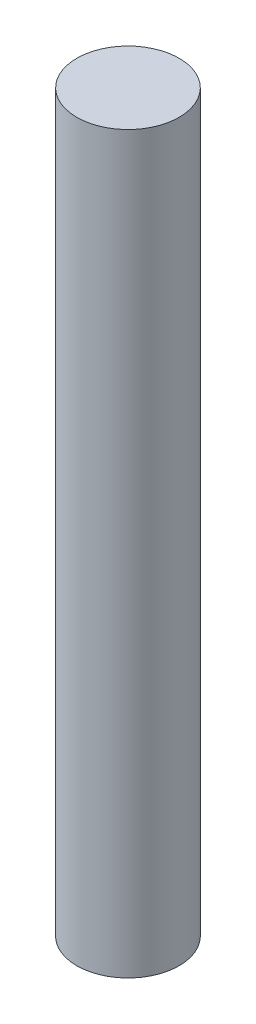
ISO-10303-21;
HEADER;
FILE_DESCRIPTION(('STEP AP214'),'2;1');
FILE_NAME('part.step','',(''),(''),'','','');
FILE_SCHEMA(('AUTOMOTIVE_DESIGN { 1 0 10303 214 1 1 1 1 }'));
ENDSEC;
DATA;
#1=APPLICATION_CONTEXT('core data for automotive mechanical design processes');
#2=APPLICATION_PROTOCOL_DEFINITION('international standard','automotive_design',2000,#1);
#3=PRODUCT_CONTEXT('',#1,'mechanical');
#4=PRODUCT('Part','Part','',(#3));
#5=PRODUCT_RELATED_PRODUCT_CATEGORY('part','',(#4));
#6=PRODUCT_DEFINITION_FORMATION('','',#4);
#7=PRODUCT_DEFINITION_CONTEXT('part definition',#1,'design');
#8=PRODUCT_DEFINITION('design','',#6,#7);
#9=PRODUCT_DEFINITION_SHAPE('','',#8);
#10=(LENGTH_UNIT() NAMED_UNIT(*) SI_UNIT(.MILLI.,.METRE.));
#11=(NAMED_UNIT(*) PLANE_ANGLE_UNIT() SI_UNIT($,.RADIAN.));
#12=(NAMED_UNIT(*) SI_UNIT($,.STERADIAN.) SOLID_ANGLE_UNIT());
#13=UNCERTAINTY_MEASURE_WITH_UNIT(LENGTH_MEASURE(1.E-05),#10,'distance_accuracy_value','');
#14=(GEOMETRIC_REPRESENTATION_CONTEXT(3) GLOBAL_UNCERTAINTY_ASSIGNED_CONTEXT((#13)) GLOBAL_UNIT_ASSIGNED_CONTEXT((#10,
#11,#12)) REPRESENTATION_CONTEXT('',''));
#15=CARTESIAN_POINT('',(0.,0.,0.));
#16=DIRECTION('',(0.,0.,1.));
#17=DIRECTION('',(1.,0.,0.));
#18=AXIS2_PLACEMENT_3D('',#15,#16,#17);
#19=CARTESIAN_POINT('',(0.,28.,0.));
#20=DIRECTION('',(0.,-1.,0.));
#21=DIRECTION('',(0.,0.,-1.));
#22=AXIS2_PLACEMENT_3D('',#19,#20,#21);
#23=CYLINDRICAL_SURFACE('',#22,1.95);
#24=CARTESIAN_POINT('',(0.,28.,0.));
#25=DIRECTION('',(0.,1.,0.));
#26=DIRECTION('',(0.,0.,1.));
#27=AXIS2_PLACEMENT_3D('',#24,#25,#26);
#28=CIRCLE('',#27,1.95);
#29=CARTESIAN_POINT('',(0.,28.,1.95));
#30=VERTEX_POINT('',#29);
#31=EDGE_CURVE('E10',#30,#30,#28,.T.);
#32=ORIENTED_EDGE('',*,*,#31,.F.);
#33=EDGE_LOOP('',(#32));
#34=FACE_BOUND('',#33,.T.);
#35=CARTESIAN_POINT('',(0.,0.,0.));
#36=DIRECTION('',(0.,1.,0.));
#37=DIRECTION('',(0.,0.,1.));
#38=AXIS2_PLACEMENT_3D('',#35,#36,#37);
#39=CIRCLE('',#38,1.95);
#40=CARTESIAN_POINT('',(0.,0.,1.95));
#41=VERTEX_POINT('',#40);
#42=EDGE_CURVE('E40',#41,#41,#39,.T.);
#43=ORIENTED_EDGE('',*,*,#42,.T.);
#44=EDGE_LOOP('',(#43));
#45=FACE_BOUND('',#44,.T.);
#46=ADVANCED_FACE('F37',(#34,#45),#23,.T.);
#47=CARTESIAN_POINT('',(0.,28.,0.));
#48=DIRECTION('',(0.,1.,0.));
#49=DIRECTION('',(0.,0.,1.));
#50=AXIS2_PLACEMENT_3D('',#47,#48,#49);
#51=PLANE('',#50);
#52=ORIENTED_EDGE('',*,*,#31,.T.);
#53=EDGE_LOOP('',(#52));
#54=FACE_BOUND('',#53,.T.);
#55=ADVANCED_FACE('F54',(#54),#51,.T.);
#56=CARTESIAN_POINT('',(0.,0.,0.));
#57=DIRECTION('',(0.,1.,0.));
#58=DIRECTION('',(0.,0.,1.));
#59=AXIS2_PLACEMENT_3D('',#56,#57,#58);
#60=PLANE('',#59);
#61=ORIENTED_EDGE('',*,*,#42,.F.);
#62=EDGE_LOOP('',(#61));
#63=FACE_BOUND('',#62,.T.);
#64=ADVANCED_FACE('F52',(#63),#60,.F.);
#65=CLOSED_SHELL('',(#46,#55,#64));
#66=MANIFOLD_SOLID_BREP('B2',#65);
#67=ADVANCED_BREP_SHAPE_REPRESENTATION('',(#18,#66),#14);
#68=SHAPE_DEFINITION_REPRESENTATION(#9,#67);
ENDSEC;
END-ISO-10303-21;
